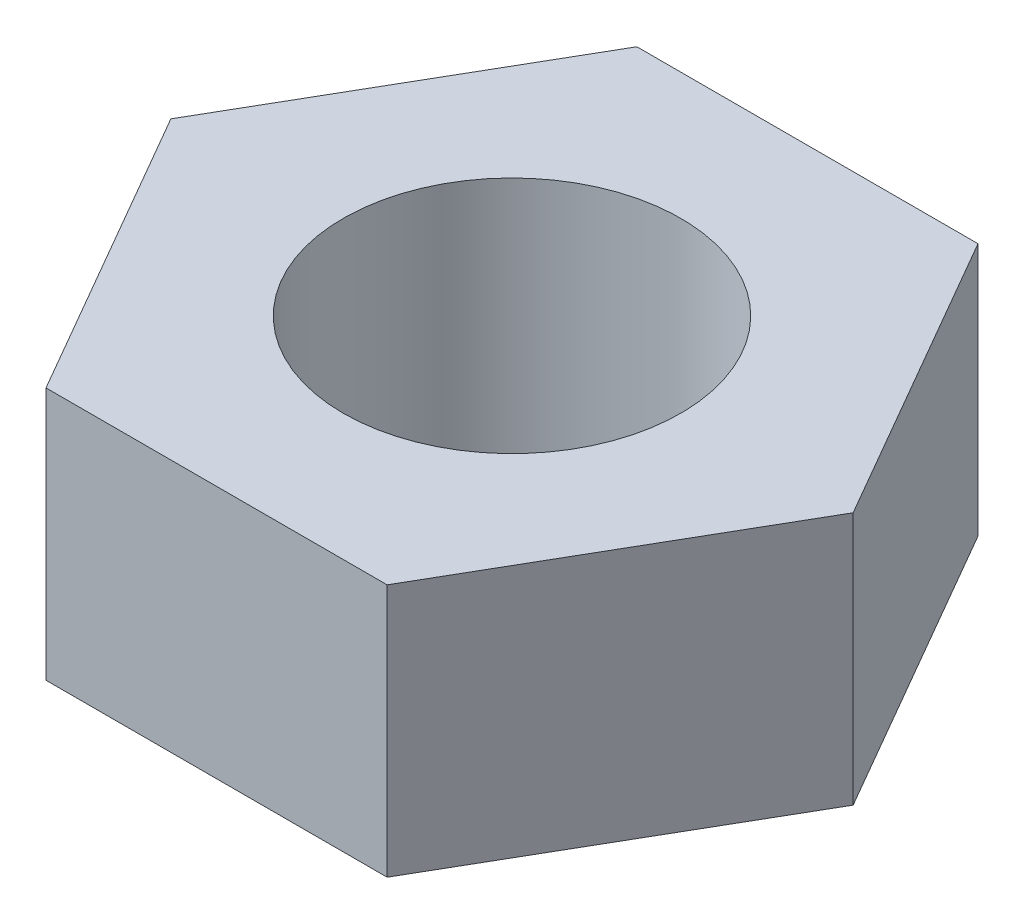
ISO-10303-21;
HEADER;
FILE_DESCRIPTION(('STEP AP214'),'2;1');
FILE_NAME('part.step','',(''),(''),'','','');
FILE_SCHEMA(('AUTOMOTIVE_DESIGN { 1 0 10303 214 1 1 1 1 }'));
ENDSEC;
DATA;
#1=APPLICATION_CONTEXT('core data for automotive mechanical design processes');
#2=APPLICATION_PROTOCOL_DEFINITION('international standard','automotive_design',2000,#1);
#3=PRODUCT_CONTEXT('',#1,'mechanical');
#4=PRODUCT('Part','Part','',(#3));
#5=PRODUCT_RELATED_PRODUCT_CATEGORY('part','',(#4));
#6=PRODUCT_DEFINITION_FORMATION('','',#4);
#7=PRODUCT_DEFINITION_CONTEXT('part definition',#1,'design');
#8=PRODUCT_DEFINITION('design','',#6,#7);
#9=PRODUCT_DEFINITION_SHAPE('','',#8);
#10=(LENGTH_UNIT() NAMED_UNIT(*) SI_UNIT(.MILLI.,.METRE.));
#11=(NAMED_UNIT(*) PLANE_ANGLE_UNIT() SI_UNIT($,.RADIAN.));
#12=(NAMED_UNIT(*) SI_UNIT($,.STERADIAN.) SOLID_ANGLE_UNIT());
#13=UNCERTAINTY_MEASURE_WITH_UNIT(LENGTH_MEASURE(1.E-05),#10,'distance_accuracy_value','');
#14=(GEOMETRIC_REPRESENTATION_CONTEXT(3) GLOBAL_UNCERTAINTY_ASSIGNED_CONTEXT((#13)) GLOBAL_UNIT_ASSIGNED_CONTEXT((#10,
#11,#12)) REPRESENTATION_CONTEXT('',''));
#15=CARTESIAN_POINT('',(0.,0.,0.));
#16=DIRECTION('',(0.,0.,1.));
#17=DIRECTION('',(1.,0.,0.));
#18=AXIS2_PLACEMENT_3D('',#15,#16,#17);
#19=CARTESIAN_POINT('',(0.,3.,0.));
#20=DIRECTION('',(0.,1.,0.));
#21=DIRECTION('',(0.,0.,1.));
#22=AXIS2_PLACEMENT_3D('',#19,#20,#21);
#23=PLANE('',#22);
#24=DIRECTION('',(0.499999999999995,0.,-0.866025403784442));
#25=VECTOR('',#24,1.);
#26=CARTESIAN_POINT('',(2.02072594216373,3.,3.49999999999998));
#27=LINE('',#26,#25);
#28=CARTESIAN_POINT('',(2.02072594216373,3.,3.49999999999998));
#29=VERTEX_POINT('',#28);
#30=CARTESIAN_POINT('',(4.04145188432738,3.,0.));
#31=VERTEX_POINT('',#30);
#32=EDGE_CURVE('E133',#29,#31,#27,.T.);
#33=ORIENTED_EDGE('',*,*,#32,.T.);
#34=DIRECTION('',(-0.500000000000001,0.,-0.866025403784438));
#35=VECTOR('',#34,1.);
#36=CARTESIAN_POINT('',(4.04145188432738,3.,0.));
#37=LINE('',#36,#35);
#38=CARTESIAN_POINT('',(2.02072594216368,3.,-3.50000000000001));
#39=VERTEX_POINT('',#38);
#40=EDGE_CURVE('E91',#31,#39,#37,.T.);
#41=ORIENTED_EDGE('',*,*,#40,.T.);
#42=DIRECTION('',(-1.,0.,0.));
#43=VECTOR('',#42,1.);
#44=CARTESIAN_POINT('',(2.02072594216368,3.,-3.50000000000001));
#45=LINE('',#44,#43);
#46=CARTESIAN_POINT('',(-2.02072594216371,3.,-3.49999999999999));
#47=VERTEX_POINT('',#46);
#48=EDGE_CURVE('E104',#39,#47,#45,.T.);
#49=ORIENTED_EDGE('',*,*,#48,.T.);
#50=DIRECTION('',(-0.499999999999995,0.,0.866025403784441));
#51=VECTOR('',#50,1.);
#52=CARTESIAN_POINT('',(-2.02072594216371,3.,-3.49999999999999));
#53=LINE('',#52,#51);
#54=CARTESIAN_POINT('',(-4.04145188432738,3.,0.));
#55=VERTEX_POINT('',#54);
#56=EDGE_CURVE('E98',#47,#55,#53,.T.);
#57=ORIENTED_EDGE('',*,*,#56,.T.);
#58=DIRECTION('',(0.500000000000007,0.,0.866025403784435));
#59=VECTOR('',#58,1.);
#60=CARTESIAN_POINT('',(-4.04145188432738,3.,0.));
#61=LINE('',#60,#59);
#62=CARTESIAN_POINT('',(-2.02072594216366,3.,3.50000000000002));
#63=VERTEX_POINT('',#62);
#64=EDGE_CURVE('E102',#55,#63,#61,.T.);
#65=ORIENTED_EDGE('',*,*,#64,.T.);
#66=DIRECTION('',(1.,0.,0.));
#67=VECTOR('',#66,1.);
#68=CARTESIAN_POINT('',(-2.02072594216366,3.,3.50000000000002));
#69=LINE('',#68,#67);
#70=EDGE_CURVE('E54',#63,#29,#69,.T.);
#71=ORIENTED_EDGE('',*,*,#70,.T.);
#72=EDGE_LOOP('',(#33,#41,#49,#57,#65,#71));
#73=FACE_BOUND('',#72,.T.);
#74=CARTESIAN_POINT('',(0.,3.,0.));
#75=DIRECTION('',(0.,1.,0.));
#76=DIRECTION('',(0.,0.,1.));
#77=AXIS2_PLACEMENT_3D('',#74,#75,#76);
#78=CIRCLE('',#77,2.);
#79=CARTESIAN_POINT('',(0.,3.,2.));
#80=VERTEX_POINT('',#79);
#81=EDGE_CURVE('E126',#80,#80,#78,.T.);
#82=ORIENTED_EDGE('',*,*,#81,.F.);
#83=EDGE_LOOP('',(#82));
#84=FACE_BOUND('',#83,.T.);
#85=ADVANCED_FACE('F37',(#73,#84),#23,.T.);
#86=CARTESIAN_POINT('',(0.,0.,0.));
#87=DIRECTION('',(0.,1.,0.));
#88=DIRECTION('',(0.,0.,1.));
#89=AXIS2_PLACEMENT_3D('',#86,#87,#88);
#90=PLANE('',#89);
#91=DIRECTION('',(0.499999999999995,0.,-0.866025403784442));
#92=VECTOR('',#91,1.);
#93=CARTESIAN_POINT('',(2.02072594216373,0.,3.49999999999998));
#94=LINE('',#93,#92);
#95=CARTESIAN_POINT('',(2.02072594216373,0.,3.49999999999998));
#96=VERTEX_POINT('',#95);
#97=CARTESIAN_POINT('',(4.04145188432738,0.,0.));
#98=VERTEX_POINT('',#97);
#99=EDGE_CURVE('E122',#96,#98,#94,.T.);
#100=ORIENTED_EDGE('',*,*,#99,.F.);
#101=DIRECTION('',(1.,0.,0.));
#102=VECTOR('',#101,1.);
#103=CARTESIAN_POINT('',(-2.02072594216366,0.,3.50000000000002));
#104=LINE('',#103,#102);
#105=CARTESIAN_POINT('',(-2.02072594216366,0.,3.50000000000002));
#106=VERTEX_POINT('',#105);
#107=EDGE_CURVE('E83',#106,#96,#104,.T.);
#108=ORIENTED_EDGE('',*,*,#107,.F.);
#109=DIRECTION('',(0.500000000000007,0.,0.866025403784435));
#110=VECTOR('',#109,1.);
#111=CARTESIAN_POINT('',(-4.04145188432738,0.,0.));
#112=LINE('',#111,#110);
#113=CARTESIAN_POINT('',(-4.04145188432738,0.,0.));
#114=VERTEX_POINT('',#113);
#115=EDGE_CURVE('E77',#114,#106,#112,.T.);
#116=ORIENTED_EDGE('',*,*,#115,.F.);
#117=DIRECTION('',(-0.499999999999995,0.,0.866025403784441));
#118=VECTOR('',#117,1.);
#119=CARTESIAN_POINT('',(-2.02072594216371,0.,-3.49999999999999));
#120=LINE('',#119,#118);
#121=CARTESIAN_POINT('',(-2.02072594216371,0.,-3.49999999999999));
#122=VERTEX_POINT('',#121);
#123=EDGE_CURVE('E112',#122,#114,#120,.T.);
#124=ORIENTED_EDGE('',*,*,#123,.F.);
#125=DIRECTION('',(-1.,0.,0.));
#126=VECTOR('',#125,1.);
#127=CARTESIAN_POINT('',(2.02072594216368,0.,-3.50000000000001));
#128=LINE('',#127,#126);
#129=CARTESIAN_POINT('',(2.02072594216368,0.,-3.50000000000001));
#130=VERTEX_POINT('',#129);
#131=EDGE_CURVE('E128',#130,#122,#128,.T.);
#132=ORIENTED_EDGE('',*,*,#131,.F.);
#133=DIRECTION('',(-0.500000000000001,0.,-0.866025403784438));
#134=VECTOR('',#133,1.);
#135=CARTESIAN_POINT('',(4.04145188432738,0.,0.));
#136=LINE('',#135,#134);
#137=EDGE_CURVE('E125',#98,#130,#136,.T.);
#138=ORIENTED_EDGE('',*,*,#137,.F.);
#139=EDGE_LOOP('',(#100,#108,#116,#124,#132,#138));
#140=FACE_BOUND('',#139,.T.);
#141=CARTESIAN_POINT('',(0.,0.,0.));
#142=DIRECTION('',(0.,1.,0.));
#143=DIRECTION('',(0.,0.,1.));
#144=AXIS2_PLACEMENT_3D('',#141,#142,#143);
#145=CIRCLE('',#144,2.);
#146=CARTESIAN_POINT('',(0.,0.,2.));
#147=VERTEX_POINT('',#146);
#148=EDGE_CURVE('E226',#147,#147,#145,.T.);
#149=ORIENTED_EDGE('',*,*,#148,.T.);
#150=EDGE_LOOP('',(#149));
#151=FACE_BOUND('',#150,.T.);
#152=ADVANCED_FACE('F142',(#140,#151),#90,.F.);
#153=CARTESIAN_POINT('',(2.02072594216373,3.,3.49999999999998));
#154=DIRECTION('',(-0.866025403784441,0.,-0.499999999999995));
#155=DIRECTION('',(-0.499999999999995,0.,0.866025403784442));
#156=AXIS2_PLACEMENT_3D('',#153,#154,#155);
#157=PLANE('',#156);
#158=ORIENTED_EDGE('',*,*,#99,.T.);
#159=DIRECTION('',(0.,-1.,0.));
#160=VECTOR('',#159,1.);
#161=CARTESIAN_POINT('',(4.04145188432738,3.,0.));
#162=LINE('',#161,#160);
#163=EDGE_CURVE('E11',#31,#98,#162,.T.);
#164=ORIENTED_EDGE('',*,*,#163,.F.);
#165=ORIENTED_EDGE('',*,*,#32,.F.);
#166=DIRECTION('',(0.,-1.,0.));
#167=VECTOR('',#166,1.);
#168=CARTESIAN_POINT('',(2.02072594216373,3.,3.49999999999998));
#169=LINE('',#168,#167);
#170=EDGE_CURVE('E118',#29,#96,#169,.T.);
#171=ORIENTED_EDGE('',*,*,#170,.T.);
#172=EDGE_LOOP('',(#158,#164,#165,#171));
#173=FACE_BOUND('',#172,.T.);
#174=ADVANCED_FACE('F39',(#173),#157,.F.);
#175=CARTESIAN_POINT('',(4.04145188432738,3.,0.));
#176=DIRECTION('',(-0.866025403784438,0.,0.500000000000001));
#177=DIRECTION('',(0.500000000000001,0.,0.866025403784438));
#178=AXIS2_PLACEMENT_3D('',#175,#176,#177);
#179=PLANE('',#178);
#180=ORIENTED_EDGE('',*,*,#137,.T.);
#181=DIRECTION('',(0.,-1.,0.));
#182=VECTOR('',#181,1.);
#183=CARTESIAN_POINT('',(2.02072594216368,3.,-3.50000000000001));
#184=LINE('',#183,#182);
#185=EDGE_CURVE('E46',#39,#130,#184,.T.);
#186=ORIENTED_EDGE('',*,*,#185,.F.);
#187=ORIENTED_EDGE('',*,*,#40,.F.);
#188=ORIENTED_EDGE('',*,*,#163,.T.);
#189=EDGE_LOOP('',(#180,#186,#187,#188));
#190=FACE_BOUND('',#189,.T.);
#191=ADVANCED_FACE('F167',(#190),#179,.F.);
#192=CARTESIAN_POINT('',(2.02072594216368,3.,-3.50000000000001));
#193=DIRECTION('',(0.,0.,1.));
#194=DIRECTION('',(1.,0.,0.));
#195=AXIS2_PLACEMENT_3D('',#192,#193,#194);
#196=PLANE('',#195);
#197=ORIENTED_EDGE('',*,*,#131,.T.);
#198=DIRECTION('',(0.,-1.,0.));
#199=VECTOR('',#198,1.);
#200=CARTESIAN_POINT('',(-2.02072594216371,3.,-3.49999999999999));
#201=LINE('',#200,#199);
#202=EDGE_CURVE('E113',#47,#122,#201,.T.);
#203=ORIENTED_EDGE('',*,*,#202,.F.);
#204=ORIENTED_EDGE('',*,*,#48,.F.);
#205=ORIENTED_EDGE('',*,*,#185,.T.);
#206=EDGE_LOOP('',(#197,#203,#204,#205));
#207=FACE_BOUND('',#206,.T.);
#208=ADVANCED_FACE('F139',(#207),#196,.F.);
#209=CARTESIAN_POINT('',(-2.02072594216371,3.,-3.49999999999999));
#210=DIRECTION('',(0.866025403784442,0.,0.499999999999995));
#211=DIRECTION('',(0.499999999999995,0.,-0.866025403784442));
#212=AXIS2_PLACEMENT_3D('',#209,#210,#211);
#213=PLANE('',#212);
#214=ORIENTED_EDGE('',*,*,#123,.T.);
#215=DIRECTION('',(0.,-1.,0.));
#216=VECTOR('',#215,1.);
#217=CARTESIAN_POINT('',(-4.04145188432738,3.,0.));
#218=LINE('',#217,#216);
#219=EDGE_CURVE('E109',#55,#114,#218,.T.);
#220=ORIENTED_EDGE('',*,*,#219,.F.);
#221=ORIENTED_EDGE('',*,*,#56,.F.);
#222=ORIENTED_EDGE('',*,*,#202,.T.);
#223=EDGE_LOOP('',(#214,#220,#221,#222));
#224=FACE_BOUND('',#223,.T.);
#225=ADVANCED_FACE('F110',(#224),#213,.F.);
#226=CARTESIAN_POINT('',(-4.04145188432738,3.,0.));
#227=DIRECTION('',(0.866025403784434,0.,-0.500000000000007));
#228=DIRECTION('',(-0.500000000000007,0.,-0.866025403784435));
#229=AXIS2_PLACEMENT_3D('',#226,#227,#228);
#230=PLANE('',#229);
#231=ORIENTED_EDGE('',*,*,#115,.T.);
#232=DIRECTION('',(0.,-1.,0.));
#233=VECTOR('',#232,1.);
#234=CARTESIAN_POINT('',(-2.02072594216366,3.,3.50000000000002));
#235=LINE('',#234,#233);
#236=EDGE_CURVE('E114',#63,#106,#235,.T.);
#237=ORIENTED_EDGE('',*,*,#236,.F.);
#238=ORIENTED_EDGE('',*,*,#64,.F.);
#239=ORIENTED_EDGE('',*,*,#219,.T.);
#240=EDGE_LOOP('',(#231,#237,#238,#239));
#241=FACE_BOUND('',#240,.T.);
#242=ADVANCED_FACE('F116',(#241),#230,.F.);
#243=CARTESIAN_POINT('',(-2.02072594216366,3.,3.50000000000002));
#244=DIRECTION('',(0.,0.,-1.));
#245=DIRECTION('',(-1.,0.,0.));
#246=AXIS2_PLACEMENT_3D('',#243,#244,#245);
#247=PLANE('',#246);
#248=ORIENTED_EDGE('',*,*,#107,.T.);
#249=ORIENTED_EDGE('',*,*,#170,.F.);
#250=ORIENTED_EDGE('',*,*,#70,.F.);
#251=ORIENTED_EDGE('',*,*,#236,.T.);
#252=EDGE_LOOP('',(#248,#249,#250,#251));
#253=FACE_BOUND('',#252,.T.);
#254=ADVANCED_FACE('F147',(#253),#247,.F.);
#255=CARTESIAN_POINT('',(0.,3.,0.));
#256=DIRECTION('',(0.,-1.,0.));
#257=DIRECTION('',(0.,0.,-1.));
#258=AXIS2_PLACEMENT_3D('',#255,#256,#257);
#259=CYLINDRICAL_SURFACE('',#258,2.);
#260=ORIENTED_EDGE('',*,*,#81,.T.);
#261=EDGE_LOOP('',(#260));
#262=FACE_BOUND('',#261,.T.);
#263=ORIENTED_EDGE('',*,*,#148,.F.);
#264=EDGE_LOOP('',(#263));
#265=FACE_BOUND('',#264,.T.);
#266=ADVANCED_FACE('F149',(#262,#265),#259,.F.);
#267=CLOSED_SHELL('',(#85,#152,#174,#191,#208,#225,#242,#254,#266));
#268=MANIFOLD_SOLID_BREP('B2',#267);
#269=ADVANCED_BREP_SHAPE_REPRESENTATION('',(#18,#268),#14);
#270=SHAPE_DEFINITION_REPRESENTATION(#9,#269);
ENDSEC;
END-ISO-10303-21;
